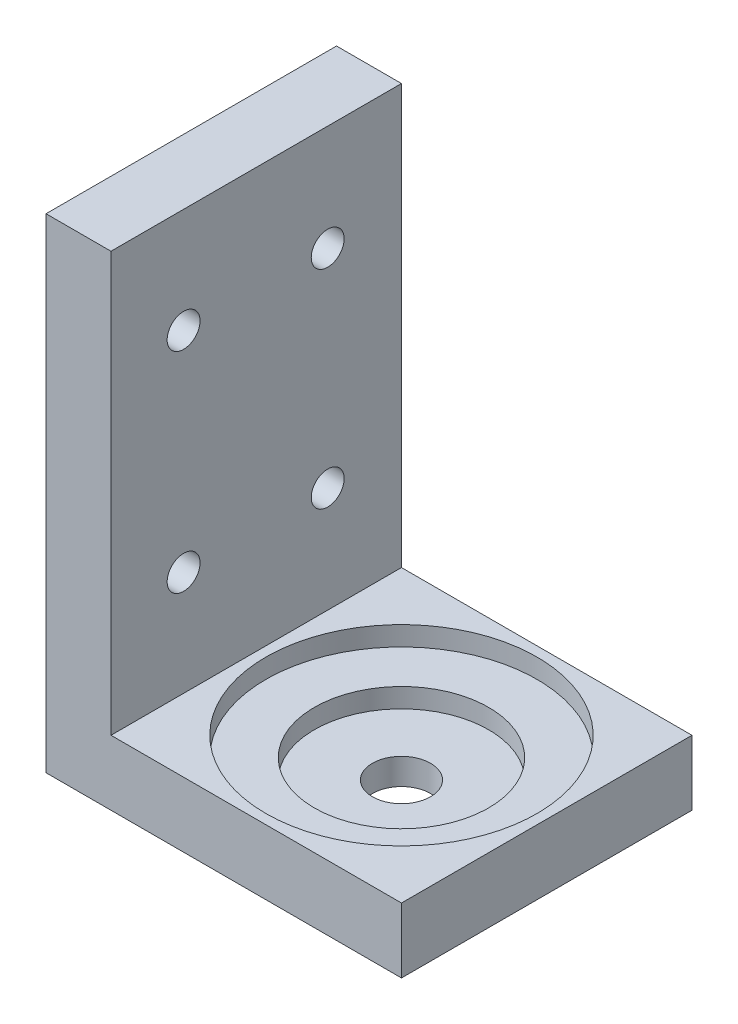
ISO-10303-21;
HEADER;
FILE_DESCRIPTION(('STEP AP214'),'2;1');
FILE_NAME('part.step','',(''),(''),'','','');
FILE_SCHEMA(('AUTOMOTIVE_DESIGN { 1 0 10303 214 1 1 1 1 }'));
ENDSEC;
DATA;
#1=APPLICATION_CONTEXT('core data for automotive mechanical design processes');
#2=APPLICATION_PROTOCOL_DEFINITION('international standard','automotive_design',2000,#1);
#3=PRODUCT_CONTEXT('',#1,'mechanical');
#4=PRODUCT('Part','Part','',(#3));
#5=PRODUCT_RELATED_PRODUCT_CATEGORY('part','',(#4));
#6=PRODUCT_DEFINITION_FORMATION('','',#4);
#7=PRODUCT_DEFINITION_CONTEXT('part definition',#1,'design');
#8=PRODUCT_DEFINITION('design','',#6,#7);
#9=PRODUCT_DEFINITION_SHAPE('','',#8);
#10=(LENGTH_UNIT() NAMED_UNIT(*) SI_UNIT(.MILLI.,.METRE.));
#11=(NAMED_UNIT(*) PLANE_ANGLE_UNIT() SI_UNIT($,.RADIAN.));
#12=(NAMED_UNIT(*) SI_UNIT($,.STERADIAN.) SOLID_ANGLE_UNIT());
#13=UNCERTAINTY_MEASURE_WITH_UNIT(LENGTH_MEASURE(1.E-05),#10,'distance_accuracy_value','');
#14=(GEOMETRIC_REPRESENTATION_CONTEXT(3) GLOBAL_UNCERTAINTY_ASSIGNED_CONTEXT((#13)) GLOBAL_UNIT_ASSIGNED_CONTEXT((#10,
#11,#12)) REPRESENTATION_CONTEXT('',''));
#15=CARTESIAN_POINT('',(0.,0.,0.));
#16=DIRECTION('',(0.,0.,1.));
#17=DIRECTION('',(1.,0.,0.));
#18=AXIS2_PLACEMENT_3D('',#15,#16,#17);
#19=CARTESIAN_POINT('',(-161.375821197418,6.708,-74.1109180471394));
#20=DIRECTION('',(0.,0.,-1.));
#21=DIRECTION('',(-1.,0.,0.));
#22=AXIS2_PLACEMENT_3D('',#19,#20,#21);
#23=PLANE('',#22);
#24=DIRECTION('',(1.,0.,0.));
#25=VECTOR('',#24,1.);
#26=CARTESIAN_POINT('',(-161.375821197418,0.,-74.1109180471394));
#27=LINE('',#26,#25);
#28=CARTESIAN_POINT('',(-168.083821243418,0.,-74.1109180471394));
#29=VERTEX_POINT('',#28);
#30=CARTESIAN_POINT('',(-131.375821197418,0.,-74.1109180471394));
#31=VERTEX_POINT('',#30);
#32=EDGE_CURVE('E69',#29,#31,#27,.T.);
#33=ORIENTED_EDGE('',*,*,#32,.T.);
#34=DIRECTION('',(0.,-1.,0.));
#35=VECTOR('',#34,1.);
#36=CARTESIAN_POINT('',(-131.375821197418,6.708,-74.1109180471394));
#37=LINE('',#36,#35);
#38=CARTESIAN_POINT('',(-131.375821197418,6.708,-74.1109180471394));
#39=VERTEX_POINT('',#38);
#40=EDGE_CURVE('E11',#39,#31,#37,.T.);
#41=ORIENTED_EDGE('',*,*,#40,.F.);
#42=DIRECTION('',(1.,0.,0.));
#43=VECTOR('',#42,1.);
#44=CARTESIAN_POINT('',(-161.375821197418,6.708,-74.1109180471394));
#45=LINE('',#44,#43);
#46=CARTESIAN_POINT('',(-161.375821197418,6.708,-74.1109180471394));
#47=VERTEX_POINT('',#46);
#48=EDGE_CURVE('E99',#47,#39,#45,.T.);
#49=ORIENTED_EDGE('',*,*,#48,.F.);
#50=DIRECTION('',(0.,1.,0.));
#51=VECTOR('',#50,1.);
#52=CARTESIAN_POINT('',(-161.375821197418,0.,-74.1109180471394));
#53=LINE('',#52,#51);
#54=CARTESIAN_POINT('',(-161.375821197418,50.,-74.1109180471394));
#55=VERTEX_POINT('',#54);
#56=EDGE_CURVE('E90',#47,#55,#53,.T.);
#57=ORIENTED_EDGE('',*,*,#56,.T.);
#58=DIRECTION('',(-1.,0.,0.));
#59=VECTOR('',#58,1.);
#60=CARTESIAN_POINT('',(-161.375821197418,50.,-74.1109180471394));
#61=LINE('',#60,#59);
#62=CARTESIAN_POINT('',(-168.083821243418,50.,-74.1109180471394));
#63=VERTEX_POINT('',#62);
#64=EDGE_CURVE('E100',#55,#63,#61,.T.);
#65=ORIENTED_EDGE('',*,*,#64,.T.);
#66=DIRECTION('',(0.,-1.,0.));
#67=VECTOR('',#66,1.);
#68=CARTESIAN_POINT('',(-168.083821243418,0.,-74.1109180471394));
#69=LINE('',#68,#67);
#70=EDGE_CURVE('E147',#63,#29,#69,.T.);
#71=ORIENTED_EDGE('',*,*,#70,.T.);
#72=EDGE_LOOP('',(#33,#41,#49,#57,#65,#71));
#73=FACE_BOUND('',#72,.T.);
#74=ADVANCED_FACE('F41',(#73),#23,.F.);
#75=CARTESIAN_POINT('',(-131.375821197418,6.708,-104.110918047139));
#76=DIRECTION('',(-1.,0.,0.));
#77=DIRECTION('',(0.,0.,1.));
#78=AXIS2_PLACEMENT_3D('',#75,#76,#77);
#79=PLANE('',#78);
#80=DIRECTION('',(0.,0.,-1.));
#81=VECTOR('',#80,1.);
#82=CARTESIAN_POINT('',(-131.375821197418,0.,-104.110918047139));
#83=LINE('',#82,#81);
#84=CARTESIAN_POINT('',(-131.375821197418,0.,-104.110918047139));
#85=VERTEX_POINT('',#84);
#86=EDGE_CURVE('E110',#31,#85,#83,.T.);
#87=ORIENTED_EDGE('',*,*,#86,.T.);
#88=DIRECTION('',(0.,-1.,0.));
#89=VECTOR('',#88,1.);
#90=CARTESIAN_POINT('',(-131.375821197418,6.708,-104.110918047139));
#91=LINE('',#90,#89);
#92=CARTESIAN_POINT('',(-131.375821197418,6.708,-104.110918047139));
#93=VERTEX_POINT('',#92);
#94=EDGE_CURVE('E49',#93,#85,#91,.T.);
#95=ORIENTED_EDGE('',*,*,#94,.F.);
#96=DIRECTION('',(0.,0.,-1.));
#97=VECTOR('',#96,1.);
#98=CARTESIAN_POINT('',(-131.375821197418,6.708,-104.110918047139));
#99=LINE('',#98,#97);
#100=EDGE_CURVE('E59',#39,#93,#99,.T.);
#101=ORIENTED_EDGE('',*,*,#100,.F.);
#102=ORIENTED_EDGE('',*,*,#40,.T.);
#103=EDGE_LOOP('',(#87,#95,#101,#102));
#104=FACE_BOUND('',#103,.T.);
#105=ADVANCED_FACE('F176',(#104),#79,.F.);
#106=CARTESIAN_POINT('',(-161.375821197418,6.708,-104.110918047139));
#107=DIRECTION('',(0.,0.,1.));
#108=DIRECTION('',(1.,0.,0.));
#109=AXIS2_PLACEMENT_3D('',#106,#107,#108);
#110=PLANE('',#109);
#111=DIRECTION('',(-1.,0.,0.));
#112=VECTOR('',#111,1.);
#113=CARTESIAN_POINT('',(-161.375821197418,0.,-104.110918047139));
#114=LINE('',#113,#112);
#115=CARTESIAN_POINT('',(-168.083821243418,0.,-104.110918047139));
#116=VERTEX_POINT('',#115);
#117=EDGE_CURVE('E104',#85,#116,#114,.T.);
#118=ORIENTED_EDGE('',*,*,#117,.T.);
#119=DIRECTION('',(0.,-1.,0.));
#120=VECTOR('',#119,1.);
#121=CARTESIAN_POINT('',(-168.083821243418,0.,-104.110918047139));
#122=LINE('',#121,#120);
#123=CARTESIAN_POINT('',(-168.083821243418,50.,-104.110918047139));
#124=VERTEX_POINT('',#123);
#125=EDGE_CURVE('E140',#124,#116,#122,.T.);
#126=ORIENTED_EDGE('',*,*,#125,.F.);
#127=DIRECTION('',(-1.,0.,0.));
#128=VECTOR('',#127,1.);
#129=CARTESIAN_POINT('',(-161.375821197418,50.,-104.110918047139));
#130=LINE('',#129,#128);
#131=CARTESIAN_POINT('',(-161.375821197418,50.,-104.110918047139));
#132=VERTEX_POINT('',#131);
#133=EDGE_CURVE('E142',#132,#124,#130,.T.);
#134=ORIENTED_EDGE('',*,*,#133,.F.);
#135=DIRECTION('',(0.,1.,0.));
#136=VECTOR('',#135,1.);
#137=CARTESIAN_POINT('',(-161.375821197418,0.,-104.110918047139));
#138=LINE('',#137,#136);
#139=CARTESIAN_POINT('',(-161.375821197418,6.708,-104.110918047139));
#140=VERTEX_POINT('',#139);
#141=EDGE_CURVE('E144',#140,#132,#138,.T.);
#142=ORIENTED_EDGE('',*,*,#141,.F.);
#143=DIRECTION('',(-1.,0.,0.));
#144=VECTOR('',#143,1.);
#145=CARTESIAN_POINT('',(-161.375821197418,6.708,-104.110918047139));
#146=LINE('',#145,#144);
#147=EDGE_CURVE('E102',#93,#140,#146,.T.);
#148=ORIENTED_EDGE('',*,*,#147,.F.);
#149=ORIENTED_EDGE('',*,*,#94,.T.);
#150=EDGE_LOOP('',(#118,#126,#134,#142,#148,#149));
#151=FACE_BOUND('',#150,.T.);
#152=ADVANCED_FACE('F121',(#151),#110,.F.);
#153=CARTESIAN_POINT('',(0.,6.708,0.));
#154=DIRECTION('',(0.,1.,0.));
#155=DIRECTION('',(0.,0.,1.));
#156=AXIS2_PLACEMENT_3D('',#153,#154,#155);
#157=PLANE('',#156);
#158=CARTESIAN_POINT('',(-146.375821197418,6.708,-89.1109180471394));
#159=DIRECTION('',(0.,1.,0.));
#160=DIRECTION('',(0.,0.,1.));
#161=AXIS2_PLACEMENT_3D('',#158,#159,#160);
#162=CIRCLE('',#161,14.);
#163=CARTESIAN_POINT('',(-146.375821197418,6.708,-75.1109180471394));
#164=VERTEX_POINT('',#163);
#165=EDGE_CURVE('E109',#164,#164,#162,.T.);
#166=ORIENTED_EDGE('',*,*,#165,.F.);
#167=EDGE_LOOP('',(#166));
#168=FACE_BOUND('',#167,.T.);
#169=DIRECTION('',(0.,0.,1.));
#170=VECTOR('',#169,1.);
#171=CARTESIAN_POINT('',(-161.375821197418,6.708,-104.110918047139));
#172=LINE('',#171,#170);
#173=EDGE_CURVE('E78',#140,#47,#172,.T.);
#174=ORIENTED_EDGE('',*,*,#173,.T.);
#175=ORIENTED_EDGE('',*,*,#48,.T.);
#176=ORIENTED_EDGE('',*,*,#100,.T.);
#177=ORIENTED_EDGE('',*,*,#147,.T.);
#178=EDGE_LOOP('',(#174,#175,#176,#177));
#179=FACE_BOUND('',#178,.T.);
#180=ADVANCED_FACE('F105',(#168,#179),#157,.T.);
#181=CARTESIAN_POINT('',(0.,0.,0.));
#182=DIRECTION('',(0.,1.,0.));
#183=DIRECTION('',(0.,0.,1.));
#184=AXIS2_PLACEMENT_3D('',#181,#182,#183);
#185=PLANE('',#184);
#186=CARTESIAN_POINT('',(-146.375821197418,0.,-89.1109180471394));
#187=DIRECTION('',(0.,1.,0.));
#188=DIRECTION('',(0.,0.,1.));
#189=AXIS2_PLACEMENT_3D('',#186,#187,#188);
#190=CIRCLE('',#189,2.99999999999999);
#191=CARTESIAN_POINT('',(-146.375821197418,0.,-86.1109180471394));
#192=VERTEX_POINT('',#191);
#193=EDGE_CURVE('E42',#192,#192,#190,.T.);
#194=ORIENTED_EDGE('',*,*,#193,.T.);
#195=EDGE_LOOP('',(#194));
#196=FACE_BOUND('',#195,.T.);
#197=ORIENTED_EDGE('',*,*,#32,.F.);
#198=DIRECTION('',(0.,0.,1.));
#199=VECTOR('',#198,1.);
#200=CARTESIAN_POINT('',(-168.083821243418,0.,-104.110918047139));
#201=LINE('',#200,#199);
#202=EDGE_CURVE('E129',#116,#29,#201,.T.);
#203=ORIENTED_EDGE('',*,*,#202,.F.);
#204=ORIENTED_EDGE('',*,*,#117,.F.);
#205=ORIENTED_EDGE('',*,*,#86,.F.);
#206=EDGE_LOOP('',(#197,#203,#204,#205));
#207=FACE_BOUND('',#206,.T.);
#208=ADVANCED_FACE('F130',(#196,#207),#185,.F.);
#209=CARTESIAN_POINT('',(-146.375821197418,4.708,-89.1109180471394));
#210=DIRECTION('',(0.,1.,0.));
#211=DIRECTION('',(0.,0.,1.));
#212=AXIS2_PLACEMENT_3D('',#209,#210,#211);
#213=CYLINDRICAL_SURFACE('',#212,14.);
#214=CARTESIAN_POINT('',(-146.375821197418,4.708,-89.1109180471394));
#215=DIRECTION('',(0.,1.,0.));
#216=DIRECTION('',(0.,0.,1.));
#217=AXIS2_PLACEMENT_3D('',#214,#215,#216);
#218=CIRCLE('',#217,14.);
#219=CARTESIAN_POINT('',(-146.375821197418,4.708,-75.1109180471394));
#220=VERTEX_POINT('',#219);
#221=EDGE_CURVE('E116',#220,#220,#218,.T.);
#222=ORIENTED_EDGE('',*,*,#221,.F.);
#223=EDGE_LOOP('',(#222));
#224=FACE_BOUND('',#223,.T.);
#225=ORIENTED_EDGE('',*,*,#165,.T.);
#226=EDGE_LOOP('',(#225));
#227=FACE_BOUND('',#226,.T.);
#228=ADVANCED_FACE('F167',(#224,#227),#213,.F.);
#229=CARTESIAN_POINT('',(-146.375821197418,4.708,-89.1109180471394));
#230=DIRECTION('',(0.,1.,0.));
#231=DIRECTION('',(0.,0.,1.));
#232=AXIS2_PLACEMENT_3D('',#229,#230,#231);
#233=PLANE('',#232);
#234=CARTESIAN_POINT('',(-146.375821197418,4.708,-89.1109180471394));
#235=DIRECTION('',(0.,1.,0.));
#236=DIRECTION('',(0.,0.,1.));
#237=AXIS2_PLACEMENT_3D('',#234,#235,#236);
#238=CIRCLE('',#237,9.00000000000001);
#239=CARTESIAN_POINT('',(-146.375821197418,4.708,-80.1109180471394));
#240=VERTEX_POINT('',#239);
#241=EDGE_CURVE('E158',#240,#240,#238,.T.);
#242=ORIENTED_EDGE('',*,*,#241,.F.);
#243=EDGE_LOOP('',(#242));
#244=FACE_BOUND('',#243,.T.);
#245=ORIENTED_EDGE('',*,*,#221,.T.);
#246=EDGE_LOOP('',(#245));
#247=FACE_BOUND('',#246,.T.);
#248=ADVANCED_FACE('F194',(#244,#247),#233,.T.);
#249=CARTESIAN_POINT('',(-146.375821197418,2.708,-89.1109180471394));
#250=DIRECTION('',(0.,1.,0.));
#251=DIRECTION('',(0.,0.,1.));
#252=AXIS2_PLACEMENT_3D('',#249,#250,#251);
#253=CYLINDRICAL_SURFACE('',#252,9.00000000000001);
#254=CARTESIAN_POINT('',(-146.375821197418,2.708,-89.1109180471394));
#255=DIRECTION('',(0.,1.,0.));
#256=DIRECTION('',(0.,0.,1.));
#257=AXIS2_PLACEMENT_3D('',#254,#255,#256);
#258=CIRCLE('',#257,9.00000000000001);
#259=CARTESIAN_POINT('',(-146.375821197418,2.708,-80.1109180471394));
#260=VERTEX_POINT('',#259);
#261=EDGE_CURVE('E154',#260,#260,#258,.T.);
#262=ORIENTED_EDGE('',*,*,#261,.F.);
#263=EDGE_LOOP('',(#262));
#264=FACE_BOUND('',#263,.T.);
#265=ORIENTED_EDGE('',*,*,#241,.T.);
#266=EDGE_LOOP('',(#265));
#267=FACE_BOUND('',#266,.T.);
#268=ADVANCED_FACE('F204',(#264,#267),#253,.F.);
#269=CARTESIAN_POINT('',(-146.375821197418,2.708,-89.1109180471394));
#270=DIRECTION('',(0.,1.,0.));
#271=DIRECTION('',(0.,0.,1.));
#272=AXIS2_PLACEMENT_3D('',#269,#270,#271);
#273=PLANE('',#272);
#274=CARTESIAN_POINT('',(-146.375821197418,2.708,-89.1109180471394));
#275=DIRECTION('',(0.,1.,0.));
#276=DIRECTION('',(0.,0.,1.));
#277=AXIS2_PLACEMENT_3D('',#274,#275,#276);
#278=CIRCLE('',#277,2.99999999999999);
#279=CARTESIAN_POINT('',(-146.375821197418,2.708,-86.1109180471394));
#280=VERTEX_POINT('',#279);
#281=EDGE_CURVE('E134',#280,#280,#278,.T.);
#282=ORIENTED_EDGE('',*,*,#281,.F.);
#283=EDGE_LOOP('',(#282));
#284=FACE_BOUND('',#283,.T.);
#285=ORIENTED_EDGE('',*,*,#261,.T.);
#286=EDGE_LOOP('',(#285));
#287=FACE_BOUND('',#286,.T.);
#288=ADVANCED_FACE('F213',(#284,#287),#273,.T.);
#289=CARTESIAN_POINT('',(-146.375821197418,-5.64199999999999,-89.1109180471394));
#290=DIRECTION('',(0.,1.,0.));
#291=DIRECTION('',(0.,0.,1.));
#292=AXIS2_PLACEMENT_3D('',#289,#290,#291);
#293=CYLINDRICAL_SURFACE('',#292,2.99999999999999);
#294=ORIENTED_EDGE('',*,*,#281,.T.);
#295=EDGE_LOOP('',(#294));
#296=FACE_BOUND('',#295,.T.);
#297=ORIENTED_EDGE('',*,*,#193,.F.);
#298=EDGE_LOOP('',(#297));
#299=FACE_BOUND('',#298,.T.);
#300=ADVANCED_FACE('F222',(#296,#299),#293,.F.);
#301=CARTESIAN_POINT('',(-161.375821197418,0.,-104.110918047139));
#302=DIRECTION('',(1.,0.,0.));
#303=DIRECTION('',(0.,0.,-1.));
#304=AXIS2_PLACEMENT_3D('',#301,#302,#303);
#305=PLANE('',#304);
#306=CARTESIAN_POINT('',(-161.375821197418,39.175,-81.6109180471394));
#307=DIRECTION('',(1.,0.,0.));
#308=DIRECTION('',(0.,0.,1.));
#309=AXIS2_PLACEMENT_3D('',#306,#307,#308);
#310=CIRCLE('',#309,1.7);
#311=CARTESIAN_POINT('',(-161.375821197418,39.175,-79.9109180471394));
#312=VERTEX_POINT('',#311);
#313=EDGE_CURVE('E329',#312,#312,#310,.T.);
#314=ORIENTED_EDGE('',*,*,#313,.F.);
#315=EDGE_LOOP('',(#314));
#316=FACE_BOUND('',#315,.T.);
#317=CARTESIAN_POINT('',(-161.375821197418,39.078,-96.4909180471394));
#318=DIRECTION('',(1.,0.,0.));
#319=DIRECTION('',(0.,0.,1.));
#320=AXIS2_PLACEMENT_3D('',#317,#318,#319);
#321=CIRCLE('',#320,1.7);
#322=CARTESIAN_POINT('',(-161.375821197418,39.078,-94.7909180471394));
#323=VERTEX_POINT('',#322);
#324=EDGE_CURVE('E331',#323,#323,#321,.T.);
#325=ORIENTED_EDGE('',*,*,#324,.F.);
#326=EDGE_LOOP('',(#325));
#327=FACE_BOUND('',#326,.T.);
#328=CARTESIAN_POINT('',(-161.375821197418,17.63,-96.4909180471394));
#329=DIRECTION('',(1.,0.,0.));
#330=DIRECTION('',(0.,0.,-1.));
#331=AXIS2_PLACEMENT_3D('',#328,#329,#330);
#332=CIRCLE('',#331,1.7);
#333=CARTESIAN_POINT('',(-161.375821197418,17.63,-98.1909180471394));
#334=VERTEX_POINT('',#333);
#335=EDGE_CURVE('E343',#334,#334,#332,.T.);
#336=ORIENTED_EDGE('',*,*,#335,.F.);
#337=EDGE_LOOP('',(#336));
#338=FACE_BOUND('',#337,.T.);
#339=CARTESIAN_POINT('',(-161.375821197418,17.533,-81.6109180471394));
#340=DIRECTION('',(1.,0.,0.));
#341=DIRECTION('',(0.,0.,-1.));
#342=AXIS2_PLACEMENT_3D('',#339,#340,#341);
#343=CIRCLE('',#342,1.7);
#344=CARTESIAN_POINT('',(-161.375821197418,17.533,-83.3109180471394));
#345=VERTEX_POINT('',#344);
#346=EDGE_CURVE('E341',#345,#345,#343,.T.);
#347=ORIENTED_EDGE('',*,*,#346,.F.);
#348=EDGE_LOOP('',(#347));
#349=FACE_BOUND('',#348,.T.);
#350=ORIENTED_EDGE('',*,*,#173,.F.);
#351=ORIENTED_EDGE('',*,*,#141,.T.);
#352=DIRECTION('',(0.,0.,1.));
#353=VECTOR('',#352,1.);
#354=CARTESIAN_POINT('',(-161.375821197418,50.,-104.110918047139));
#355=LINE('',#354,#353);
#356=EDGE_CURVE('E94',#132,#55,#355,.T.);
#357=ORIENTED_EDGE('',*,*,#356,.T.);
#358=ORIENTED_EDGE('',*,*,#56,.F.);
#359=EDGE_LOOP('',(#350,#351,#357,#358));
#360=FACE_BOUND('',#359,.T.);
#361=ADVANCED_FACE('F93',(#316,#327,#338,#349,#360),#305,.T.);
#362=CARTESIAN_POINT('',(-168.083821243418,0.,-104.110918047139));
#363=DIRECTION('',(-1.,0.,0.));
#364=DIRECTION('',(0.,0.,1.));
#365=AXIS2_PLACEMENT_3D('',#362,#363,#364);
#366=PLANE('',#365);
#367=CARTESIAN_POINT('',(-168.083821197418,39.175,-81.6109180471394));
#368=DIRECTION('',(1.,0.,0.));
#369=DIRECTION('',(0.,0.,1.));
#370=AXIS2_PLACEMENT_3D('',#367,#368,#369);
#371=CIRCLE('',#370,1.7);
#372=CARTESIAN_POINT('',(-168.083821197418,39.175,-79.9109180471394));
#373=VERTEX_POINT('',#372);
#374=EDGE_CURVE('E330',#373,#373,#371,.T.);
#375=ORIENTED_EDGE('',*,*,#374,.T.);
#376=EDGE_LOOP('',(#375));
#377=FACE_BOUND('',#376,.T.);
#378=CARTESIAN_POINT('',(-168.083821197418,39.078,-96.4909180471394));
#379=DIRECTION('',(1.,0.,0.));
#380=DIRECTION('',(0.,0.,1.));
#381=AXIS2_PLACEMENT_3D('',#378,#379,#380);
#382=CIRCLE('',#381,1.7);
#383=CARTESIAN_POINT('',(-168.083821197418,39.078,-94.7909180471394));
#384=VERTEX_POINT('',#383);
#385=EDGE_CURVE('E332',#384,#384,#382,.T.);
#386=ORIENTED_EDGE('',*,*,#385,.T.);
#387=EDGE_LOOP('',(#386));
#388=FACE_BOUND('',#387,.T.);
#389=CARTESIAN_POINT('',(-168.083821197418,17.63,-96.4909180471394));
#390=DIRECTION('',(1.,0.,0.));
#391=DIRECTION('',(0.,0.,-1.));
#392=AXIS2_PLACEMENT_3D('',#389,#390,#391);
#393=CIRCLE('',#392,1.7);
#394=CARTESIAN_POINT('',(-168.083821197418,17.63,-98.1909180471394));
#395=VERTEX_POINT('',#394);
#396=EDGE_CURVE('E352',#395,#395,#393,.T.);
#397=ORIENTED_EDGE('',*,*,#396,.T.);
#398=EDGE_LOOP('',(#397));
#399=FACE_BOUND('',#398,.T.);
#400=CARTESIAN_POINT('',(-168.083821197418,17.533,-81.6109180471394));
#401=DIRECTION('',(1.,0.,0.));
#402=DIRECTION('',(0.,0.,-1.));
#403=AXIS2_PLACEMENT_3D('',#400,#401,#402);
#404=CIRCLE('',#403,1.7);
#405=CARTESIAN_POINT('',(-168.083821197418,17.533,-83.3109180471394));
#406=VERTEX_POINT('',#405);
#407=EDGE_CURVE('E98',#406,#406,#404,.T.);
#408=ORIENTED_EDGE('',*,*,#407,.T.);
#409=EDGE_LOOP('',(#408));
#410=FACE_BOUND('',#409,.T.);
#411=ORIENTED_EDGE('',*,*,#70,.F.);
#412=DIRECTION('',(0.,0.,1.));
#413=VECTOR('',#412,1.);
#414=CARTESIAN_POINT('',(-168.083821243418,50.,-104.110918047139));
#415=LINE('',#414,#413);
#416=EDGE_CURVE('E133',#124,#63,#415,.T.);
#417=ORIENTED_EDGE('',*,*,#416,.F.);
#418=ORIENTED_EDGE('',*,*,#125,.T.);
#419=ORIENTED_EDGE('',*,*,#202,.T.);
#420=EDGE_LOOP('',(#411,#417,#418,#419));
#421=FACE_BOUND('',#420,.T.);
#422=ADVANCED_FACE('F138',(#377,#388,#399,#410,#421),#366,.T.);
#423=CARTESIAN_POINT('',(-161.375821197418,50.,-104.110918047139));
#424=DIRECTION('',(0.,1.,0.));
#425=DIRECTION('',(-1.,0.,0.));
#426=AXIS2_PLACEMENT_3D('',#423,#424,#425);
#427=PLANE('',#426);
#428=ORIENTED_EDGE('',*,*,#64,.F.);
#429=ORIENTED_EDGE('',*,*,#356,.F.);
#430=ORIENTED_EDGE('',*,*,#133,.T.);
#431=ORIENTED_EDGE('',*,*,#416,.T.);
#432=EDGE_LOOP('',(#428,#429,#430,#431));
#433=FACE_BOUND('',#432,.T.);
#434=ADVANCED_FACE('F275',(#433),#427,.T.);
#435=CARTESIAN_POINT('',(-168.083821197418,17.533,-81.6109180471394));
#436=DIRECTION('',(1.,0.,0.));
#437=DIRECTION('',(0.,0.,-1.));
#438=AXIS2_PLACEMENT_3D('',#435,#436,#437);
#439=CYLINDRICAL_SURFACE('',#438,1.7);
#440=ORIENTED_EDGE('',*,*,#407,.F.);
#441=EDGE_LOOP('',(#440));
#442=FACE_BOUND('',#441,.T.);
#443=ORIENTED_EDGE('',*,*,#346,.T.);
#444=EDGE_LOOP('',(#443));
#445=FACE_BOUND('',#444,.T.);
#446=ADVANCED_FACE('F282',(#442,#445),#439,.F.);
#447=CARTESIAN_POINT('',(-168.083821197418,17.63,-96.4909180471394));
#448=DIRECTION('',(1.,0.,0.));
#449=DIRECTION('',(0.,0.,-1.));
#450=AXIS2_PLACEMENT_3D('',#447,#448,#449);
#451=CYLINDRICAL_SURFACE('',#450,1.7);
#452=ORIENTED_EDGE('',*,*,#396,.F.);
#453=EDGE_LOOP('',(#452));
#454=FACE_BOUND('',#453,.T.);
#455=ORIENTED_EDGE('',*,*,#335,.T.);
#456=EDGE_LOOP('',(#455));
#457=FACE_BOUND('',#456,.T.);
#458=ADVANCED_FACE('F292',(#454,#457),#451,.F.);
#459=CARTESIAN_POINT('',(-168.083821197418,39.078,-96.4909180471394));
#460=DIRECTION('',(1.,0.,0.));
#461=DIRECTION('',(0.,0.,-1.));
#462=AXIS2_PLACEMENT_3D('',#459,#460,#461);
#463=CYLINDRICAL_SURFACE('',#462,1.7);
#464=ORIENTED_EDGE('',*,*,#385,.F.);
#465=EDGE_LOOP('',(#464));
#466=FACE_BOUND('',#465,.T.);
#467=ORIENTED_EDGE('',*,*,#324,.T.);
#468=EDGE_LOOP('',(#467));
#469=FACE_BOUND('',#468,.T.);
#470=ADVANCED_FACE('F301',(#466,#469),#463,.F.);
#471=CARTESIAN_POINT('',(-168.083821197418,39.175,-81.6109180471394));
#472=DIRECTION('',(1.,0.,0.));
#473=DIRECTION('',(0.,0.,-1.));
#474=AXIS2_PLACEMENT_3D('',#471,#472,#473);
#475=CYLINDRICAL_SURFACE('',#474,1.7);
#476=ORIENTED_EDGE('',*,*,#374,.F.);
#477=EDGE_LOOP('',(#476));
#478=FACE_BOUND('',#477,.T.);
#479=ORIENTED_EDGE('',*,*,#313,.T.);
#480=EDGE_LOOP('',(#479));
#481=FACE_BOUND('',#480,.T.);
#482=ADVANCED_FACE('F313',(#478,#481),#475,.F.);
#483=CLOSED_SHELL('',(#74,#105,#152,#180,#208,#228,#248,#268,#288,#300,#361,#422,#434,#446,#458,
#470,#482));
#484=MANIFOLD_SOLID_BREP('B2',#483);
#485=ADVANCED_BREP_SHAPE_REPRESENTATION('',(#18,#484),#14);
#486=SHAPE_DEFINITION_REPRESENTATION(#9,#485);
ENDSEC;
END-ISO-10303-21;
